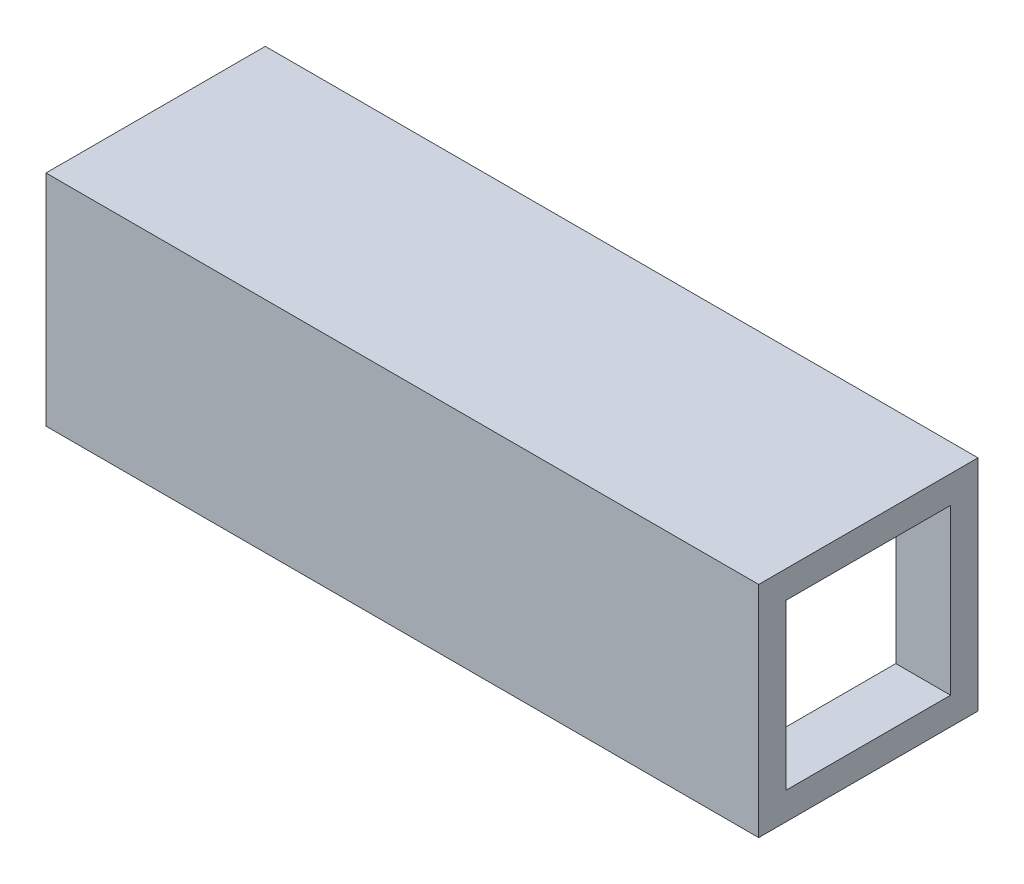
ISO-10303-21;
HEADER;
FILE_DESCRIPTION(('STEP AP214'),'2;1');
FILE_NAME('part.step','',(''),(''),'','','');
FILE_SCHEMA(('AUTOMOTIVE_DESIGN { 1 0 10303 214 1 1 1 1 }'));
ENDSEC;
DATA;
#1=APPLICATION_CONTEXT('core data for automotive mechanical design processes');
#2=APPLICATION_PROTOCOL_DEFINITION('international standard','automotive_design',2000,#1);
#3=PRODUCT_CONTEXT('',#1,'mechanical');
#4=PRODUCT('Part','Part','',(#3));
#5=PRODUCT_RELATED_PRODUCT_CATEGORY('part','',(#4));
#6=PRODUCT_DEFINITION_FORMATION('','',#4);
#7=PRODUCT_DEFINITION_CONTEXT('part definition',#1,'design');
#8=PRODUCT_DEFINITION('design','',#6,#7);
#9=PRODUCT_DEFINITION_SHAPE('','',#8);
#10=(LENGTH_UNIT() NAMED_UNIT(*) SI_UNIT(.MILLI.,.METRE.));
#11=(NAMED_UNIT(*) PLANE_ANGLE_UNIT() SI_UNIT($,.RADIAN.));
#12=(NAMED_UNIT(*) SI_UNIT($,.STERADIAN.) SOLID_ANGLE_UNIT());
#13=UNCERTAINTY_MEASURE_WITH_UNIT(LENGTH_MEASURE(1.E-05),#10,'distance_accuracy_value','');
#14=(GEOMETRIC_REPRESENTATION_CONTEXT(3) GLOBAL_UNCERTAINTY_ASSIGNED_CONTEXT((#13)) GLOBAL_UNIT_ASSIGNED_CONTEXT((#10,
#11,#12)) REPRESENTATION_CONTEXT('',''));
#15=CARTESIAN_POINT('',(0.,0.,0.));
#16=DIRECTION('',(0.,0.,1.));
#17=DIRECTION('',(1.,0.,0.));
#18=AXIS2_PLACEMENT_3D('',#15,#16,#17);
#19=CARTESIAN_POINT('',(82.55,-9.525,9.525));
#20=DIRECTION('',(0.,1.,0.));
#21=DIRECTION('',(0.,0.,1.));
#22=AXIS2_PLACEMENT_3D('',#19,#20,#21);
#23=PLANE('',#22);
#24=DIRECTION('',(0.,0.,-1.));
#25=VECTOR('',#24,1.);
#26=CARTESIAN_POINT('',(76.2,-9.525,9.525));
#27=LINE('',#26,#25);
#28=CARTESIAN_POINT('',(76.2,-9.525,9.52500000000001));
#29=VERTEX_POINT('',#28);
#30=CARTESIAN_POINT('',(76.2,-9.525,-9.525));
#31=VERTEX_POINT('',#30);
#32=EDGE_CURVE('E222',#29,#31,#27,.T.);
#33=ORIENTED_EDGE('',*,*,#32,.F.);
#34=DIRECTION('',(-1.,0.,0.));
#35=VECTOR('',#34,1.);
#36=CARTESIAN_POINT('',(82.55,-9.525,9.525));
#37=LINE('',#36,#35);
#38=CARTESIAN_POINT('',(82.55,-9.525,9.525));
#39=VERTEX_POINT('',#38);
#40=EDGE_CURVE('E189',#39,#29,#37,.T.);
#41=ORIENTED_EDGE('',*,*,#40,.F.);
#42=DIRECTION('',(0.,0.,-1.));
#43=VECTOR('',#42,1.);
#44=CARTESIAN_POINT('',(82.55,-9.525,9.525));
#45=LINE('',#44,#43);
#46=CARTESIAN_POINT('',(82.55,-9.525,-9.525));
#47=VERTEX_POINT('',#46);
#48=EDGE_CURVE('E227',#39,#47,#45,.T.);
#49=ORIENTED_EDGE('',*,*,#48,.T.);
#50=DIRECTION('',(-1.,0.,0.));
#51=VECTOR('',#50,1.);
#52=CARTESIAN_POINT('',(82.55,-9.525,-9.525));
#53=LINE('',#52,#51);
#54=EDGE_CURVE('E198',#47,#31,#53,.T.);
#55=ORIENTED_EDGE('',*,*,#54,.T.);
#56=EDGE_LOOP('',(#33,#41,#49,#55));
#57=FACE_BOUND('',#56,.T.);
#58=ADVANCED_FACE('F33',(#57),#23,.T.);
#59=CARTESIAN_POINT('',(82.55,-9.525,-9.525));
#60=DIRECTION('',(0.,0.,1.));
#61=DIRECTION('',(0.,-1.,0.));
#62=AXIS2_PLACEMENT_3D('',#59,#60,#61);
#63=PLANE('',#62);
#64=DIRECTION('',(0.,1.,0.));
#65=VECTOR('',#64,1.);
#66=CARTESIAN_POINT('',(76.2,-9.525,-9.525));
#67=LINE('',#66,#65);
#68=CARTESIAN_POINT('',(76.2,9.525,-9.52499999999999));
#69=VERTEX_POINT('',#68);
#70=EDGE_CURVE('E231',#31,#69,#67,.T.);
#71=ORIENTED_EDGE('',*,*,#70,.F.);
#72=ORIENTED_EDGE('',*,*,#54,.F.);
#73=DIRECTION('',(0.,1.,0.));
#74=VECTOR('',#73,1.);
#75=CARTESIAN_POINT('',(82.55,-9.525,-9.525));
#76=LINE('',#75,#74);
#77=CARTESIAN_POINT('',(82.55,9.525,-9.525));
#78=VERTEX_POINT('',#77);
#79=EDGE_CURVE('E224',#47,#78,#76,.T.);
#80=ORIENTED_EDGE('',*,*,#79,.T.);
#81=DIRECTION('',(-1.,0.,0.));
#82=VECTOR('',#81,1.);
#83=CARTESIAN_POINT('',(82.55,9.525,-9.525));
#84=LINE('',#83,#82);
#85=EDGE_CURVE('E202',#78,#69,#84,.T.);
#86=ORIENTED_EDGE('',*,*,#85,.T.);
#87=EDGE_LOOP('',(#71,#72,#80,#86));
#88=FACE_BOUND('',#87,.T.);
#89=ADVANCED_FACE('F276',(#88),#63,.T.);
#90=CARTESIAN_POINT('',(82.55,0.,0.));
#91=DIRECTION('',(-1.,0.,0.));
#92=DIRECTION('',(0.,0.,1.));
#93=AXIS2_PLACEMENT_3D('',#90,#91,#92);
#94=PLANE('',#93);
#95=DIRECTION('',(0.,1.,0.));
#96=VECTOR('',#95,1.);
#97=CARTESIAN_POINT('',(82.55,-12.7,-12.7));
#98=LINE('',#97,#96);
#99=CARTESIAN_POINT('',(82.55,-12.7,-12.7));
#100=VERTEX_POINT('',#99);
#101=CARTESIAN_POINT('',(82.55,12.7,-12.7));
#102=VERTEX_POINT('',#101);
#103=EDGE_CURVE('E157',#100,#102,#98,.T.);
#104=ORIENTED_EDGE('',*,*,#103,.T.);
#105=DIRECTION('',(0.,0.,1.));
#106=VECTOR('',#105,1.);
#107=CARTESIAN_POINT('',(82.55,12.7,12.7));
#108=LINE('',#107,#106);
#109=CARTESIAN_POINT('',(82.55,12.7,12.7));
#110=VERTEX_POINT('',#109);
#111=EDGE_CURVE('E192',#102,#110,#108,.T.);
#112=ORIENTED_EDGE('',*,*,#111,.T.);
#113=DIRECTION('',(0.,-1.,0.));
#114=VECTOR('',#113,1.);
#115=CARTESIAN_POINT('',(82.55,-12.7,12.7));
#116=LINE('',#115,#114);
#117=CARTESIAN_POINT('',(82.55,-12.7,12.7));
#118=VERTEX_POINT('',#117);
#119=EDGE_CURVE('E175',#110,#118,#116,.T.);
#120=ORIENTED_EDGE('',*,*,#119,.T.);
#121=DIRECTION('',(0.,0.,-1.));
#122=VECTOR('',#121,1.);
#123=CARTESIAN_POINT('',(82.55,-12.7,12.7));
#124=LINE('',#123,#122);
#125=EDGE_CURVE('E163',#118,#100,#124,.T.);
#126=ORIENTED_EDGE('',*,*,#125,.T.);
#127=EDGE_LOOP('',(#104,#112,#120,#126));
#128=FACE_BOUND('',#127,.T.);
#129=DIRECTION('',(0.,-1.,0.));
#130=VECTOR('',#129,1.);
#131=CARTESIAN_POINT('',(82.55,-9.525,9.525));
#132=LINE('',#131,#130);
#133=CARTESIAN_POINT('',(82.55,9.525,9.525));
#134=VERTEX_POINT('',#133);
#135=EDGE_CURVE('E212',#134,#39,#132,.T.);
#136=ORIENTED_EDGE('',*,*,#135,.F.);
#137=DIRECTION('',(0.,0.,1.));
#138=VECTOR('',#137,1.);
#139=CARTESIAN_POINT('',(82.55,9.525,9.525));
#140=LINE('',#139,#138);
#141=EDGE_CURVE('E208',#78,#134,#140,.T.);
#142=ORIENTED_EDGE('',*,*,#141,.F.);
#143=ORIENTED_EDGE('',*,*,#79,.F.);
#144=ORIENTED_EDGE('',*,*,#48,.F.);
#145=EDGE_LOOP('',(#136,#142,#143,#144));
#146=FACE_BOUND('',#145,.T.);
#147=ADVANCED_FACE('F269',(#128,#146),#94,.F.);
#148=CARTESIAN_POINT('',(0.,0.,0.));
#149=DIRECTION('',(-1.,0.,0.));
#150=DIRECTION('',(0.,0.,1.));
#151=AXIS2_PLACEMENT_3D('',#148,#149,#150);
#152=PLANE('',#151);
#153=DIRECTION('',(0.,1.,0.));
#154=VECTOR('',#153,1.);
#155=CARTESIAN_POINT('',(0.,-12.7,-12.7));
#156=LINE('',#155,#154);
#157=CARTESIAN_POINT('',(0.,-12.7,-12.7));
#158=VERTEX_POINT('',#157);
#159=CARTESIAN_POINT('',(0.,12.7,-12.7));
#160=VERTEX_POINT('',#159);
#161=EDGE_CURVE('E184',#158,#160,#156,.T.);
#162=ORIENTED_EDGE('',*,*,#161,.F.);
#163=DIRECTION('',(0.,0.,-1.));
#164=VECTOR('',#163,1.);
#165=CARTESIAN_POINT('',(0.,-12.7,12.7));
#166=LINE('',#165,#164);
#167=CARTESIAN_POINT('',(0.,-12.7,12.7));
#168=VERTEX_POINT('',#167);
#169=EDGE_CURVE('E165',#168,#158,#166,.T.);
#170=ORIENTED_EDGE('',*,*,#169,.F.);
#171=DIRECTION('',(0.,-1.,0.));
#172=VECTOR('',#171,1.);
#173=CARTESIAN_POINT('',(0.,-12.7,12.7));
#174=LINE('',#173,#172);
#175=CARTESIAN_POINT('',(0.,12.7,12.7));
#176=VERTEX_POINT('',#175);
#177=EDGE_CURVE('E174',#176,#168,#174,.T.);
#178=ORIENTED_EDGE('',*,*,#177,.F.);
#179=DIRECTION('',(0.,0.,1.));
#180=VECTOR('',#179,1.);
#181=CARTESIAN_POINT('',(0.,12.7,12.7));
#182=LINE('',#181,#180);
#183=EDGE_CURVE('E182',#160,#176,#182,.T.);
#184=ORIENTED_EDGE('',*,*,#183,.F.);
#185=EDGE_LOOP('',(#162,#170,#178,#184));
#186=FACE_BOUND('',#185,.T.);
#187=DIRECTION('',(0.,0.,1.));
#188=VECTOR('',#187,1.);
#189=CARTESIAN_POINT('',(0.,9.525,9.525));
#190=LINE('',#189,#188);
#191=CARTESIAN_POINT('',(0.,9.525,-9.525));
#192=VERTEX_POINT('',#191);
#193=CARTESIAN_POINT('',(0.,9.525,9.525));
#194=VERTEX_POINT('',#193);
#195=EDGE_CURVE('E209',#192,#194,#190,.T.);
#196=ORIENTED_EDGE('',*,*,#195,.T.);
#197=DIRECTION('',(0.,-1.,0.));
#198=VECTOR('',#197,1.);
#199=CARTESIAN_POINT('',(0.,-9.525,9.525));
#200=LINE('',#199,#198);
#201=CARTESIAN_POINT('',(0.,-9.525,9.525));
#202=VERTEX_POINT('',#201);
#203=EDGE_CURVE('E219',#194,#202,#200,.T.);
#204=ORIENTED_EDGE('',*,*,#203,.T.);
#205=DIRECTION('',(0.,0.,-1.));
#206=VECTOR('',#205,1.);
#207=CARTESIAN_POINT('',(0.,-9.525,9.525));
#208=LINE('',#207,#206);
#209=CARTESIAN_POINT('',(0.,-9.525,-9.525));
#210=VERTEX_POINT('',#209);
#211=EDGE_CURVE('E216',#202,#210,#208,.T.);
#212=ORIENTED_EDGE('',*,*,#211,.T.);
#213=DIRECTION('',(0.,1.,0.));
#214=VECTOR('',#213,1.);
#215=CARTESIAN_POINT('',(0.,-9.525,-9.525));
#216=LINE('',#215,#214);
#217=EDGE_CURVE('E213',#210,#192,#216,.T.);
#218=ORIENTED_EDGE('',*,*,#217,.T.);
#219=EDGE_LOOP('',(#196,#204,#212,#218));
#220=FACE_BOUND('',#219,.T.);
#221=ADVANCED_FACE('F180',(#186,#220),#152,.T.);
#222=CARTESIAN_POINT('',(82.55,-12.7,-12.7));
#223=DIRECTION('',(0.,0.,1.));
#224=DIRECTION('',(1.,0.,0.));
#225=AXIS2_PLACEMENT_3D('',#222,#223,#224);
#226=PLANE('',#225);
#227=DIRECTION('',(-1.,0.,0.));
#228=VECTOR('',#227,1.);
#229=CARTESIAN_POINT('',(82.55,-12.7,-12.7));
#230=LINE('',#229,#228);
#231=CARTESIAN_POINT('',(76.2,-12.7,-12.7));
#232=VERTEX_POINT('',#231);
#233=EDGE_CURVE('E147',#100,#232,#230,.T.);
#234=ORIENTED_EDGE('',*,*,#233,.T.);
#235=DIRECTION('',(0.,-1.,0.));
#236=VECTOR('',#235,1.);
#237=CARTESIAN_POINT('',(76.2,-12.7,-12.7));
#238=LINE('',#237,#236);
#239=CARTESIAN_POINT('',(76.2,9.525,-12.7));
#240=VERTEX_POINT('',#239);
#241=EDGE_CURVE('E132',#240,#232,#238,.T.);
#242=ORIENTED_EDGE('',*,*,#241,.F.);
#243=DIRECTION('',(1.,0.,0.));
#244=VECTOR('',#243,1.);
#245=CARTESIAN_POINT('',(76.2,9.525,-12.7));
#246=LINE('',#245,#244);
#247=CARTESIAN_POINT('',(48.26,9.525,-12.7));
#248=VERTEX_POINT('',#247);
#249=EDGE_CURVE('E153',#248,#240,#246,.T.);
#250=ORIENTED_EDGE('',*,*,#249,.F.);
#251=DIRECTION('',(0.,1.,0.));
#252=VECTOR('',#251,1.);
#253=CARTESIAN_POINT('',(48.26,-12.7,-12.7));
#254=LINE('',#253,#252);
#255=CARTESIAN_POINT('',(48.26,-12.7,-12.7));
#256=VERTEX_POINT('',#255);
#257=EDGE_CURVE('E140',#256,#248,#254,.T.);
#258=ORIENTED_EDGE('',*,*,#257,.F.);
#259=EDGE_CURVE('E159',#256,#158,#230,.T.);
#260=ORIENTED_EDGE('',*,*,#259,.T.);
#261=ORIENTED_EDGE('',*,*,#161,.T.);
#262=DIRECTION('',(-1.,0.,0.));
#263=VECTOR('',#262,1.);
#264=CARTESIAN_POINT('',(82.55,12.7,-12.7));
#265=LINE('',#264,#263);
#266=EDGE_CURVE('E11',#102,#160,#265,.T.);
#267=ORIENTED_EDGE('',*,*,#266,.F.);
#268=ORIENTED_EDGE('',*,*,#103,.F.);
#269=EDGE_LOOP('',(#234,#242,#250,#258,#260,#261,#267,#268));
#270=FACE_BOUND('',#269,.T.);
#271=ADVANCED_FACE('F35',(#270),#226,.F.);
#272=CARTESIAN_POINT('',(82.55,12.7,12.7));
#273=DIRECTION('',(0.,-1.,0.));
#274=DIRECTION('',(0.,0.,-1.));
#275=AXIS2_PLACEMENT_3D('',#272,#273,#274);
#276=PLANE('',#275);
#277=ORIENTED_EDGE('',*,*,#183,.T.);
#278=DIRECTION('',(-1.,0.,0.));
#279=VECTOR('',#278,1.);
#280=CARTESIAN_POINT('',(82.55,12.7,12.7));
#281=LINE('',#280,#279);
#282=EDGE_CURVE('E41',#110,#176,#281,.T.);
#283=ORIENTED_EDGE('',*,*,#282,.F.);
#284=ORIENTED_EDGE('',*,*,#111,.F.);
#285=ORIENTED_EDGE('',*,*,#266,.T.);
#286=EDGE_LOOP('',(#277,#283,#284,#285));
#287=FACE_BOUND('',#286,.T.);
#288=ADVANCED_FACE('F275',(#287),#276,.F.);
#289=CARTESIAN_POINT('',(82.55,-12.7,12.7));
#290=DIRECTION('',(0.,0.,-1.));
#291=DIRECTION('',(-1.,0.,0.));
#292=AXIS2_PLACEMENT_3D('',#289,#290,#291);
#293=PLANE('',#292);
#294=ORIENTED_EDGE('',*,*,#177,.T.);
#295=DIRECTION('',(-1.,0.,0.));
#296=VECTOR('',#295,1.);
#297=CARTESIAN_POINT('',(82.55,-12.7,12.7));
#298=LINE('',#297,#296);
#299=EDGE_CURVE('E158',#118,#168,#298,.T.);
#300=ORIENTED_EDGE('',*,*,#299,.F.);
#301=ORIENTED_EDGE('',*,*,#119,.F.);
#302=ORIENTED_EDGE('',*,*,#282,.T.);
#303=EDGE_LOOP('',(#294,#300,#301,#302));
#304=FACE_BOUND('',#303,.T.);
#305=ADVANCED_FACE('F172',(#304),#293,.F.);
#306=CARTESIAN_POINT('',(82.55,-12.7,12.7));
#307=DIRECTION('',(0.,1.,0.));
#308=DIRECTION('',(0.,0.,1.));
#309=AXIS2_PLACEMENT_3D('',#306,#307,#308);
#310=PLANE('',#309);
#311=DIRECTION('',(1.,0.,0.));
#312=VECTOR('',#311,1.);
#313=CARTESIAN_POINT('',(76.2,-12.7,9.52500000000001));
#314=LINE('',#313,#312);
#315=CARTESIAN_POINT('',(48.26,-12.7,9.52500000000001));
#316=VERTEX_POINT('',#315);
#317=CARTESIAN_POINT('',(76.2,-12.7,9.525));
#318=VERTEX_POINT('',#317);
#319=EDGE_CURVE('E151',#316,#318,#314,.T.);
#320=ORIENTED_EDGE('',*,*,#319,.T.);
#321=DIRECTION('',(0.,0.,-1.));
#322=VECTOR('',#321,1.);
#323=CARTESIAN_POINT('',(76.2,-12.7,45.2264597040513));
#324=LINE('',#323,#322);
#325=EDGE_CURVE('E48',#318,#232,#324,.T.);
#326=ORIENTED_EDGE('',*,*,#325,.T.);
#327=ORIENTED_EDGE('',*,*,#233,.F.);
#328=ORIENTED_EDGE('',*,*,#125,.F.);
#329=ORIENTED_EDGE('',*,*,#299,.T.);
#330=ORIENTED_EDGE('',*,*,#169,.T.);
#331=ORIENTED_EDGE('',*,*,#259,.F.);
#332=DIRECTION('',(0.,0.,-1.));
#333=VECTOR('',#332,1.);
#334=CARTESIAN_POINT('',(48.26,-12.7,45.2264597040513));
#335=LINE('',#334,#333);
#336=EDGE_CURVE('E152',#316,#256,#335,.T.);
#337=ORIENTED_EDGE('',*,*,#336,.F.);
#338=EDGE_LOOP('',(#320,#326,#327,#328,#329,#330,#331,#337));
#339=FACE_BOUND('',#338,.T.);
#340=ADVANCED_FACE('F145',(#339),#310,.F.);
#341=CARTESIAN_POINT('',(82.55,-9.525,9.525));
#342=DIRECTION('',(0.,0.,-1.));
#343=DIRECTION('',(-1.,0.,0.));
#344=AXIS2_PLACEMENT_3D('',#341,#342,#343);
#345=PLANE('',#344);
#346=ORIENTED_EDGE('',*,*,#203,.F.);
#347=DIRECTION('',(-1.,0.,0.));
#348=VECTOR('',#347,1.);
#349=CARTESIAN_POINT('',(82.55,9.525,9.525));
#350=LINE('',#349,#348);
#351=EDGE_CURVE('E206',#134,#194,#350,.T.);
#352=ORIENTED_EDGE('',*,*,#351,.F.);
#353=ORIENTED_EDGE('',*,*,#135,.T.);
#354=ORIENTED_EDGE('',*,*,#40,.T.);
#355=DIRECTION('',(0.,1.,0.));
#356=VECTOR('',#355,1.);
#357=CARTESIAN_POINT('',(76.2,-12.7,9.52500000000001));
#358=LINE('',#357,#356);
#359=EDGE_CURVE('E237',#318,#29,#358,.T.);
#360=ORIENTED_EDGE('',*,*,#359,.F.);
#361=ORIENTED_EDGE('',*,*,#319,.F.);
#362=DIRECTION('',(0.,-1.,0.));
#363=VECTOR('',#362,1.);
#364=CARTESIAN_POINT('',(48.26,-12.7,9.52500000000001));
#365=LINE('',#364,#363);
#366=CARTESIAN_POINT('',(48.26,-9.525,9.52500000000001));
#367=VERTEX_POINT('',#366);
#368=EDGE_CURVE('E242',#367,#316,#365,.T.);
#369=ORIENTED_EDGE('',*,*,#368,.F.);
#370=EDGE_CURVE('E197',#367,#202,#37,.T.);
#371=ORIENTED_EDGE('',*,*,#370,.T.);
#372=EDGE_LOOP('',(#346,#352,#353,#354,#360,#361,#369,#371));
#373=FACE_BOUND('',#372,.T.);
#374=ADVANCED_FACE('F253',(#373),#345,.T.);
#375=DIRECTION('',(0.,0.,1.));
#376=VECTOR('',#375,1.);
#377=CARTESIAN_POINT('',(48.26,-9.525,9.525));
#378=LINE('',#377,#376);
#379=CARTESIAN_POINT('',(48.26,-9.525,-9.525));
#380=VERTEX_POINT('',#379);
#381=EDGE_CURVE('E233',#380,#367,#378,.T.);
#382=ORIENTED_EDGE('',*,*,#381,.F.);
#383=EDGE_CURVE('E201',#380,#210,#53,.T.);
#384=ORIENTED_EDGE('',*,*,#383,.T.);
#385=ORIENTED_EDGE('',*,*,#211,.F.);
#386=ORIENTED_EDGE('',*,*,#370,.F.);
#387=EDGE_LOOP('',(#382,#384,#385,#386));
#388=FACE_BOUND('',#387,.T.);
#389=ADVANCED_FACE('F264',(#388),#23,.T.);
#390=DIRECTION('',(0.,-1.,0.));
#391=VECTOR('',#390,1.);
#392=CARTESIAN_POINT('',(48.26,-9.525,-9.525));
#393=LINE('',#392,#391);
#394=CARTESIAN_POINT('',(48.26,9.525,-9.525));
#395=VERTEX_POINT('',#394);
#396=EDGE_CURVE('E235',#395,#380,#393,.T.);
#397=ORIENTED_EDGE('',*,*,#396,.F.);
#398=EDGE_CURVE('E205',#395,#192,#84,.T.);
#399=ORIENTED_EDGE('',*,*,#398,.T.);
#400=ORIENTED_EDGE('',*,*,#217,.F.);
#401=ORIENTED_EDGE('',*,*,#383,.F.);
#402=EDGE_LOOP('',(#397,#399,#400,#401));
#403=FACE_BOUND('',#402,.T.);
#404=ADVANCED_FACE('F261',(#403),#63,.T.);
#405=CARTESIAN_POINT('',(82.55,9.525,9.525));
#406=DIRECTION('',(0.,-1.,0.));
#407=DIRECTION('',(0.,0.,-1.));
#408=AXIS2_PLACEMENT_3D('',#405,#406,#407);
#409=PLANE('',#408);
#410=ORIENTED_EDGE('',*,*,#398,.F.);
#411=DIRECTION('',(0.,0.,-1.));
#412=VECTOR('',#411,1.);
#413=CARTESIAN_POINT('',(48.26,9.525,45.2264597040513));
#414=LINE('',#413,#412);
#415=EDGE_CURVE('E56',#395,#248,#414,.T.);
#416=ORIENTED_EDGE('',*,*,#415,.T.);
#417=ORIENTED_EDGE('',*,*,#249,.T.);
#418=DIRECTION('',(0.,0.,-1.));
#419=VECTOR('',#418,1.);
#420=CARTESIAN_POINT('',(76.2,9.525,45.2264597040513));
#421=LINE('',#420,#419);
#422=EDGE_CURVE('E135',#69,#240,#421,.T.);
#423=ORIENTED_EDGE('',*,*,#422,.F.);
#424=ORIENTED_EDGE('',*,*,#85,.F.);
#425=ORIENTED_EDGE('',*,*,#141,.T.);
#426=ORIENTED_EDGE('',*,*,#351,.T.);
#427=ORIENTED_EDGE('',*,*,#195,.F.);
#428=EDGE_LOOP('',(#410,#416,#417,#423,#424,#425,#426,#427));
#429=FACE_BOUND('',#428,.T.);
#430=ADVANCED_FACE('F257',(#429),#409,.T.);
#431=CARTESIAN_POINT('',(76.2,-12.7,45.2264597040513));
#432=DIRECTION('',(1.,0.,0.));
#433=DIRECTION('',(0.,0.,-1.));
#434=AXIS2_PLACEMENT_3D('',#431,#432,#433);
#435=PLANE('',#434);
#436=ORIENTED_EDGE('',*,*,#32,.T.);
#437=ORIENTED_EDGE('',*,*,#70,.T.);
#438=ORIENTED_EDGE('',*,*,#422,.T.);
#439=ORIENTED_EDGE('',*,*,#241,.T.);
#440=ORIENTED_EDGE('',*,*,#325,.F.);
#441=ORIENTED_EDGE('',*,*,#359,.T.);
#442=EDGE_LOOP('',(#436,#437,#438,#439,#440,#441));
#443=FACE_BOUND('',#442,.T.);
#444=ADVANCED_FACE('F133',(#443),#435,.F.);
#445=CARTESIAN_POINT('',(48.26,-12.7,45.2264597040513));
#446=DIRECTION('',(-1.,0.,0.));
#447=DIRECTION('',(0.,0.,1.));
#448=AXIS2_PLACEMENT_3D('',#445,#446,#447);
#449=PLANE('',#448);
#450=ORIENTED_EDGE('',*,*,#381,.T.);
#451=ORIENTED_EDGE('',*,*,#368,.T.);
#452=ORIENTED_EDGE('',*,*,#336,.T.);
#453=ORIENTED_EDGE('',*,*,#257,.T.);
#454=ORIENTED_EDGE('',*,*,#415,.F.);
#455=ORIENTED_EDGE('',*,*,#396,.T.);
#456=EDGE_LOOP('',(#450,#451,#452,#453,#454,#455));
#457=FACE_BOUND('',#456,.T.);
#458=ADVANCED_FACE('F247',(#457),#449,.F.);
#459=CLOSED_SHELL('',(#58,#89,#147,#221,#271,#288,#305,#340,#374,#389,#404,#430,#444,#458));
#460=MANIFOLD_SOLID_BREP('B2',#459);
#461=ADVANCED_BREP_SHAPE_REPRESENTATION('',(#18,#460),#14);
#462=SHAPE_DEFINITION_REPRESENTATION(#9,#461);
ENDSEC;
END-ISO-10303-21;
